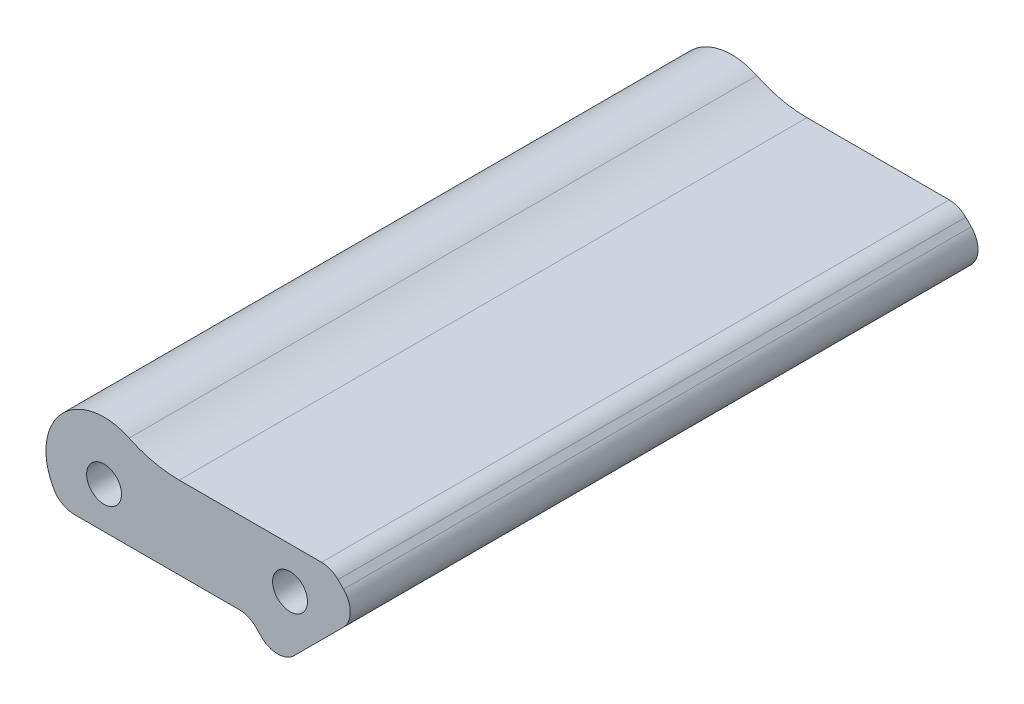
ISO-10303-21;
HEADER;
FILE_DESCRIPTION(('STEP AP214'),'2;1');
FILE_NAME('part.step','',(''),(''),'','','');
FILE_SCHEMA(('AUTOMOTIVE_DESIGN { 1 0 10303 214 1 1 1 1 }'));
ENDSEC;
DATA;
#1=APPLICATION_CONTEXT('core data for automotive mechanical design processes');
#2=APPLICATION_PROTOCOL_DEFINITION('international standard','automotive_design',2000,#1);
#3=PRODUCT_CONTEXT('',#1,'mechanical');
#4=PRODUCT('Part','Part','',(#3));
#5=PRODUCT_RELATED_PRODUCT_CATEGORY('part','',(#4));
#6=PRODUCT_DEFINITION_FORMATION('','',#4);
#7=PRODUCT_DEFINITION_CONTEXT('part definition',#1,'design');
#8=PRODUCT_DEFINITION('design','',#6,#7);
#9=PRODUCT_DEFINITION_SHAPE('','',#8);
#10=(LENGTH_UNIT() NAMED_UNIT(*) SI_UNIT(.MILLI.,.METRE.));
#11=(NAMED_UNIT(*) PLANE_ANGLE_UNIT() SI_UNIT($,.RADIAN.));
#12=(NAMED_UNIT(*) SI_UNIT($,.STERADIAN.) SOLID_ANGLE_UNIT());
#13=UNCERTAINTY_MEASURE_WITH_UNIT(LENGTH_MEASURE(1.E-05),#10,'distance_accuracy_value','');
#14=(GEOMETRIC_REPRESENTATION_CONTEXT(3) GLOBAL_UNCERTAINTY_ASSIGNED_CONTEXT((#13)) GLOBAL_UNIT_ASSIGNED_CONTEXT((#10,
#11,#12)) REPRESENTATION_CONTEXT('',''));
#15=CARTESIAN_POINT('',(0.,0.,0.));
#16=DIRECTION('',(0.,0.,1.));
#17=DIRECTION('',(1.,0.,0.));
#18=AXIS2_PLACEMENT_3D('',#15,#16,#17);
#19=CARTESIAN_POINT('',(10.7071067811866,1.53553390593272,54.));
#20=DIRECTION('',(0.,0.,1.));
#21=DIRECTION('',(1.,0.,0.));
#22=AXIS2_PLACEMENT_3D('',#19,#20,#21);
#23=PLANE('',#22);
#24=CARTESIAN_POINT('',(-8.,0.,54.));
#25=DIRECTION('',(0.,0.,1.));
#26=DIRECTION('',(1.,0.,0.));
#27=AXIS2_PLACEMENT_3D('',#24,#25,#26);
#28=CIRCLE('',#27,1.5);
#29=CARTESIAN_POINT('',(-6.5,0.,54.));
#30=VERTEX_POINT('',#29);
#31=EDGE_CURVE('E166',#30,#30,#28,.T.);
#32=ORIENTED_EDGE('',*,*,#31,.F.);
#33=EDGE_LOOP('',(#32));
#34=FACE_BOUND('',#33,.T.);
#35=CARTESIAN_POINT('',(10.7071067811866,1.53553390593272,54.));
#36=DIRECTION('',(0.,0.,1.));
#37=DIRECTION('',(1.,0.,0.));
#38=AXIS2_PLACEMENT_3D('',#35,#36,#37);
#39=CIRCLE('',#38,2.);
#40=CARTESIAN_POINT('',(12.1213203435597,2.9497474683058,54.));
#41=VERTEX_POINT('',#40);
#42=CARTESIAN_POINT('',(10.7071067811865,3.53553390593272,54.));
#43=VERTEX_POINT('',#42);
#44=EDGE_CURVE('E185',#41,#43,#39,.T.);
#45=ORIENTED_EDGE('',*,*,#44,.T.);
#46=DIRECTION('',(-1.,0.,0.));
#47=VECTOR('',#46,1.);
#48=CARTESIAN_POINT('',(10.7071067811865,3.53553390593272,54.));
#49=LINE('',#48,#47);
#50=CARTESIAN_POINT('',(-1.5355339059327,3.53553390593273,54.));
#51=VERTEX_POINT('',#50);
#52=EDGE_CURVE('E113',#43,#51,#49,.T.);
#53=ORIENTED_EDGE('',*,*,#52,.T.);
#54=CARTESIAN_POINT('',(-1.5355339059327,13.5355339059327,54.));
#55=DIRECTION('',(0.,0.,-1.));
#56=DIRECTION('',(-1.,0.,0.));
#57=AXIS2_PLACEMENT_3D('',#54,#55,#56);
#58=CIRCLE('',#57,9.99999999999999);
#59=CARTESIAN_POINT('',(-5.84517796864423,4.51184463531091,54.));
#60=VERTEX_POINT('',#59);
#61=EDGE_CURVE('E212',#51,#60,#58,.T.);
#62=ORIENTED_EDGE('',*,*,#61,.T.);
#63=CARTESIAN_POINT('',(-8.,0.,54.));
#64=DIRECTION('',(0.,0.,1.));
#65=DIRECTION('',(1.,0.,0.));
#66=AXIS2_PLACEMENT_3D('',#63,#64,#65);
#67=CIRCLE('',#66,5.);
#68=CARTESIAN_POINT('',(-12.2953901723343,-2.55922317655453,54.));
#69=VERTEX_POINT('',#68);
#70=EDGE_CURVE('E231',#60,#69,#67,.T.);
#71=ORIENTED_EDGE('',*,*,#70,.T.);
#72=CARTESIAN_POINT('',(-10.5772341034006,-1.53553390593272,54.));
#73=DIRECTION('',(0.,0.,1.));
#74=DIRECTION('',(-1.,0.,0.));
#75=AXIS2_PLACEMENT_3D('',#72,#73,#74);
#76=CIRCLE('',#75,2.);
#77=CARTESIAN_POINT('',(-10.5772341034006,-3.53553390593272,54.));
#78=VERTEX_POINT('',#77);
#79=EDGE_CURVE('E228',#69,#78,#76,.T.);
#80=ORIENTED_EDGE('',*,*,#79,.T.);
#81=DIRECTION('',(1.,0.,0.));
#82=VECTOR('',#81,1.);
#83=CARTESIAN_POINT('',(-10.5772341034006,-3.53553390593272,54.));
#84=LINE('',#83,#82);
#85=CARTESIAN_POINT('',(3.63603896932104,-3.53553390593272,54.));
#86=VERTEX_POINT('',#85);
#87=EDGE_CURVE('E230',#78,#86,#84,.T.);
#88=ORIENTED_EDGE('',*,*,#87,.T.);
#89=CARTESIAN_POINT('',(3.63603896932105,-5.53553390593272,54.));
#90=DIRECTION('',(0.,0.,-1.));
#91=DIRECTION('',(-1.,0.,0.));
#92=AXIS2_PLACEMENT_3D('',#89,#90,#91);
#93=CIRCLE('',#92,2.);
#94=CARTESIAN_POINT('',(5.05025253169415,-4.12132034355963,54.));
#95=VERTEX_POINT('',#94);
#96=EDGE_CURVE('E233',#86,#95,#93,.T.);
#97=ORIENTED_EDGE('',*,*,#96,.T.);
#98=DIRECTION('',(0.707106781186545,-0.70710678118655,0.));
#99=VECTOR('',#98,1.);
#100=CARTESIAN_POINT('',(5.05025253169415,-4.12132034355963,54.));
#101=LINE('',#100,#99);
#102=CARTESIAN_POINT('',(5.52512626584705,-4.59619407771254,54.));
#103=VERTEX_POINT('',#102);
#104=EDGE_CURVE('E239',#95,#103,#101,.T.);
#105=ORIENTED_EDGE('',*,*,#104,.T.);
#106=CARTESIAN_POINT('',(6.93933982822016,-3.18198051533946,54.));
#107=DIRECTION('',(0.,0.,1.));
#108=DIRECTION('',(1.,0.,0.));
#109=AXIS2_PLACEMENT_3D('',#106,#107,#108);
#110=CIRCLE('',#109,2.);
#111=CARTESIAN_POINT('',(8.35355339059326,-4.59619407771255,54.));
#112=VERTEX_POINT('',#111);
#113=EDGE_CURVE('E144',#103,#112,#110,.T.);
#114=ORIENTED_EDGE('',*,*,#113,.T.);
#115=DIRECTION('',(0.707106781186551,0.707106781186544,0.));
#116=VECTOR('',#115,1.);
#117=CARTESIAN_POINT('',(8.35355339059326,-4.59619407771255,54.));
#118=LINE('',#117,#116);
#119=CARTESIAN_POINT('',(12.5961940777125,-0.353553390593309,54.));
#120=VERTEX_POINT('',#119);
#121=EDGE_CURVE('E138',#112,#120,#118,.T.);
#122=ORIENTED_EDGE('',*,*,#121,.T.);
#123=CARTESIAN_POINT('',(11.1819805153395,1.0606601717798,54.));
#124=DIRECTION('',(0.,0.,1.));
#125=DIRECTION('',(1.,0.,0.));
#126=AXIS2_PLACEMENT_3D('',#123,#124,#125);
#127=CIRCLE('',#126,2.);
#128=CARTESIAN_POINT('',(12.5961940777126,2.4748737341529,54.));
#129=VERTEX_POINT('',#128);
#130=EDGE_CURVE('E142',#120,#129,#127,.T.);
#131=ORIENTED_EDGE('',*,*,#130,.T.);
#132=DIRECTION('',(-0.707106781186543,0.707106781186552,0.));
#133=VECTOR('',#132,1.);
#134=CARTESIAN_POINT('',(12.5961940777126,2.4748737341529,54.));
#135=LINE('',#134,#133);
#136=EDGE_CURVE('E58',#129,#41,#135,.T.);
#137=ORIENTED_EDGE('',*,*,#136,.T.);
#138=EDGE_LOOP('',(#45,#53,#62,#71,#80,#88,#97,#105,#114,#122,#131,#137));
#139=FACE_BOUND('',#138,.T.);
#140=CARTESIAN_POINT('',(8.,0.,54.));
#141=DIRECTION('',(0.,0.,1.));
#142=DIRECTION('',(1.,0.,0.));
#143=AXIS2_PLACEMENT_3D('',#140,#141,#142);
#144=CIRCLE('',#143,1.5);
#145=CARTESIAN_POINT('',(9.5,0.,54.));
#146=VERTEX_POINT('',#145);
#147=EDGE_CURVE('E281',#146,#146,#144,.T.);
#148=ORIENTED_EDGE('',*,*,#147,.F.);
#149=EDGE_LOOP('',(#148));
#150=FACE_BOUND('',#149,.T.);
#151=ADVANCED_FACE('F41',(#34,#139,#150),#23,.T.);
#152=CARTESIAN_POINT('',(10.7071067811866,1.53553390593272,0.));
#153=DIRECTION('',(0.,0.,1.));
#154=DIRECTION('',(1.,0.,0.));
#155=AXIS2_PLACEMENT_3D('',#152,#153,#154);
#156=PLANE('',#155);
#157=CARTESIAN_POINT('',(10.7071067811866,1.53553390593272,0.));
#158=DIRECTION('',(0.,0.,1.));
#159=DIRECTION('',(1.,0.,0.));
#160=AXIS2_PLACEMENT_3D('',#157,#158,#159);
#161=CIRCLE('',#160,2.);
#162=CARTESIAN_POINT('',(12.1213203435597,2.9497474683058,0.));
#163=VERTEX_POINT('',#162);
#164=CARTESIAN_POINT('',(10.7071067811865,3.53553390593272,0.));
#165=VERTEX_POINT('',#164);
#166=EDGE_CURVE('E162',#163,#165,#161,.T.);
#167=ORIENTED_EDGE('',*,*,#166,.F.);
#168=DIRECTION('',(-0.707106781186543,0.707106781186552,0.));
#169=VECTOR('',#168,1.);
#170=CARTESIAN_POINT('',(12.5961940777126,2.4748737341529,0.));
#171=LINE('',#170,#169);
#172=CARTESIAN_POINT('',(12.5961940777126,2.4748737341529,0.));
#173=VERTEX_POINT('',#172);
#174=EDGE_CURVE('E105',#173,#163,#171,.T.);
#175=ORIENTED_EDGE('',*,*,#174,.F.);
#176=CARTESIAN_POINT('',(11.1819805153395,1.0606601717798,0.));
#177=DIRECTION('',(0.,0.,1.));
#178=DIRECTION('',(1.,0.,0.));
#179=AXIS2_PLACEMENT_3D('',#176,#177,#178);
#180=CIRCLE('',#179,2.);
#181=CARTESIAN_POINT('',(12.5961940777125,-0.353553390593309,0.));
#182=VERTEX_POINT('',#181);
#183=EDGE_CURVE('E99',#182,#173,#180,.T.);
#184=ORIENTED_EDGE('',*,*,#183,.F.);
#185=DIRECTION('',(0.707106781186551,0.707106781186544,0.));
#186=VECTOR('',#185,1.);
#187=CARTESIAN_POINT('',(8.35355339059326,-4.59619407771255,0.));
#188=LINE('',#187,#186);
#189=CARTESIAN_POINT('',(8.35355339059326,-4.59619407771255,0.));
#190=VERTEX_POINT('',#189);
#191=EDGE_CURVE('E152',#190,#182,#188,.T.);
#192=ORIENTED_EDGE('',*,*,#191,.F.);
#193=CARTESIAN_POINT('',(6.93933982822016,-3.18198051533946,0.));
#194=DIRECTION('',(0.,0.,1.));
#195=DIRECTION('',(1.,0.,0.));
#196=AXIS2_PLACEMENT_3D('',#193,#194,#195);
#197=CIRCLE('',#196,2.);
#198=CARTESIAN_POINT('',(5.52512626584705,-4.59619407771254,0.));
#199=VERTEX_POINT('',#198);
#200=EDGE_CURVE('E180',#199,#190,#197,.T.);
#201=ORIENTED_EDGE('',*,*,#200,.F.);
#202=DIRECTION('',(0.707106781186545,-0.70710678118655,0.));
#203=VECTOR('',#202,1.);
#204=CARTESIAN_POINT('',(5.05025253169415,-4.12132034355963,0.));
#205=LINE('',#204,#203);
#206=CARTESIAN_POINT('',(5.05025253169415,-4.12132034355963,0.));
#207=VERTEX_POINT('',#206);
#208=EDGE_CURVE('E178',#207,#199,#205,.T.);
#209=ORIENTED_EDGE('',*,*,#208,.F.);
#210=CARTESIAN_POINT('',(3.63603896932105,-5.53553390593272,0.));
#211=DIRECTION('',(0.,0.,-1.));
#212=DIRECTION('',(-1.,0.,0.));
#213=AXIS2_PLACEMENT_3D('',#210,#211,#212);
#214=CIRCLE('',#213,2.);
#215=CARTESIAN_POINT('',(3.63603896932104,-3.53553390593272,0.));
#216=VERTEX_POINT('',#215);
#217=EDGE_CURVE('E176',#216,#207,#214,.T.);
#218=ORIENTED_EDGE('',*,*,#217,.F.);
#219=DIRECTION('',(1.,0.,0.));
#220=VECTOR('',#219,1.);
#221=CARTESIAN_POINT('',(-10.5772341034006,-3.53553390593272,0.));
#222=LINE('',#221,#220);
#223=CARTESIAN_POINT('',(-10.5772341034006,-3.53553390593272,0.));
#224=VERTEX_POINT('',#223);
#225=EDGE_CURVE('E174',#224,#216,#222,.T.);
#226=ORIENTED_EDGE('',*,*,#225,.F.);
#227=CARTESIAN_POINT('',(-10.5772341034006,-1.53553390593272,0.));
#228=DIRECTION('',(0.,0.,1.));
#229=DIRECTION('',(-1.,0.,0.));
#230=AXIS2_PLACEMENT_3D('',#227,#228,#229);
#231=CIRCLE('',#230,2.);
#232=CARTESIAN_POINT('',(-12.2953901723343,-2.55922317655453,0.));
#233=VERTEX_POINT('',#232);
#234=EDGE_CURVE('E172',#233,#224,#231,.T.);
#235=ORIENTED_EDGE('',*,*,#234,.F.);
#236=CARTESIAN_POINT('',(-8.,0.,0.));
#237=DIRECTION('',(0.,0.,1.));
#238=DIRECTION('',(1.,0.,0.));
#239=AXIS2_PLACEMENT_3D('',#236,#237,#238);
#240=CIRCLE('',#239,5.);
#241=CARTESIAN_POINT('',(-5.84517796864423,4.51184463531091,0.));
#242=VERTEX_POINT('',#241);
#243=EDGE_CURVE('E170',#242,#233,#240,.T.);
#244=ORIENTED_EDGE('',*,*,#243,.F.);
#245=CARTESIAN_POINT('',(-1.5355339059327,13.5355339059327,0.));
#246=DIRECTION('',(0.,0.,-1.));
#247=DIRECTION('',(-1.,0.,0.));
#248=AXIS2_PLACEMENT_3D('',#245,#246,#247);
#249=CIRCLE('',#248,9.99999999999999);
#250=CARTESIAN_POINT('',(-1.5355339059327,3.53553390593273,0.));
#251=VERTEX_POINT('',#250);
#252=EDGE_CURVE('E168',#251,#242,#249,.T.);
#253=ORIENTED_EDGE('',*,*,#252,.F.);
#254=DIRECTION('',(-1.,0.,0.));
#255=VECTOR('',#254,1.);
#256=CARTESIAN_POINT('',(10.7071067811865,3.53553390593272,0.));
#257=LINE('',#256,#255);
#258=EDGE_CURVE('E165',#165,#251,#257,.T.);
#259=ORIENTED_EDGE('',*,*,#258,.F.);
#260=EDGE_LOOP('',(#167,#175,#184,#192,#201,#209,#218,#226,#235,#244,#253,#259));
#261=FACE_BOUND('',#260,.T.);
#262=CARTESIAN_POINT('',(-8.,0.,0.));
#263=DIRECTION('',(0.,0.,1.));
#264=DIRECTION('',(1.,0.,0.));
#265=AXIS2_PLACEMENT_3D('',#262,#263,#264);
#266=CIRCLE('',#265,1.5);
#267=CARTESIAN_POINT('',(-6.5,0.,0.));
#268=VERTEX_POINT('',#267);
#269=EDGE_CURVE('E287',#268,#268,#266,.T.);
#270=ORIENTED_EDGE('',*,*,#269,.T.);
#271=EDGE_LOOP('',(#270));
#272=FACE_BOUND('',#271,.T.);
#273=CARTESIAN_POINT('',(8.,0.,0.));
#274=DIRECTION('',(0.,0.,1.));
#275=DIRECTION('',(1.,0.,0.));
#276=AXIS2_PLACEMENT_3D('',#273,#274,#275);
#277=CIRCLE('',#276,1.5);
#278=CARTESIAN_POINT('',(9.5,0.,0.));
#279=VERTEX_POINT('',#278);
#280=EDGE_CURVE('E284',#279,#279,#277,.T.);
#281=ORIENTED_EDGE('',*,*,#280,.T.);
#282=EDGE_LOOP('',(#281));
#283=FACE_BOUND('',#282,.T.);
#284=ADVANCED_FACE('F216',(#261,#272,#283),#156,.F.);
#285=CARTESIAN_POINT('',(10.7071067811866,1.53553390593272,54.));
#286=DIRECTION('',(0.,0.,-1.));
#287=DIRECTION('',(-1.,0.,0.));
#288=AXIS2_PLACEMENT_3D('',#285,#286,#287);
#289=CYLINDRICAL_SURFACE('',#288,2.);
#290=ORIENTED_EDGE('',*,*,#166,.T.);
#291=DIRECTION('',(0.,0.,-1.));
#292=VECTOR('',#291,1.);
#293=CARTESIAN_POINT('',(10.7071067811865,3.53553390593272,54.));
#294=LINE('',#293,#292);
#295=EDGE_CURVE('E11',#43,#165,#294,.T.);
#296=ORIENTED_EDGE('',*,*,#295,.F.);
#297=ORIENTED_EDGE('',*,*,#44,.F.);
#298=DIRECTION('',(0.,0.,-1.));
#299=VECTOR('',#298,1.);
#300=CARTESIAN_POINT('',(12.1213203435597,2.9497474683058,54.));
#301=LINE('',#300,#299);
#302=EDGE_CURVE('E158',#41,#163,#301,.T.);
#303=ORIENTED_EDGE('',*,*,#302,.T.);
#304=EDGE_LOOP('',(#290,#296,#297,#303));
#305=FACE_BOUND('',#304,.T.);
#306=ADVANCED_FACE('F43',(#305),#289,.T.);
#307=CARTESIAN_POINT('',(10.7071067811865,3.53553390593272,54.));
#308=DIRECTION('',(0.,-1.,0.));
#309=DIRECTION('',(1.,0.,0.));
#310=AXIS2_PLACEMENT_3D('',#307,#308,#309);
#311=PLANE('',#310);
#312=ORIENTED_EDGE('',*,*,#258,.T.);
#313=DIRECTION('',(0.,0.,-1.));
#314=VECTOR('',#313,1.);
#315=CARTESIAN_POINT('',(-1.5355339059327,3.53553390593273,54.));
#316=LINE('',#315,#314);
#317=EDGE_CURVE('E50',#51,#251,#316,.T.);
#318=ORIENTED_EDGE('',*,*,#317,.F.);
#319=ORIENTED_EDGE('',*,*,#52,.F.);
#320=ORIENTED_EDGE('',*,*,#295,.T.);
#321=EDGE_LOOP('',(#312,#318,#319,#320));
#322=FACE_BOUND('',#321,.T.);
#323=ADVANCED_FACE('F382',(#322),#311,.F.);
#324=CARTESIAN_POINT('',(-1.5355339059327,13.5355339059327,54.));
#325=DIRECTION('',(0.,0.,-1.));
#326=DIRECTION('',(-1.,0.,0.));
#327=AXIS2_PLACEMENT_3D('',#324,#325,#326);
#328=CYLINDRICAL_SURFACE('',#327,9.99999999999999);
#329=ORIENTED_EDGE('',*,*,#252,.T.);
#330=DIRECTION('',(0.,0.,-1.));
#331=VECTOR('',#330,1.);
#332=CARTESIAN_POINT('',(-5.84517796864423,4.51184463531091,54.));
#333=LINE('',#332,#331);
#334=EDGE_CURVE('E204',#60,#242,#333,.T.);
#335=ORIENTED_EDGE('',*,*,#334,.F.);
#336=ORIENTED_EDGE('',*,*,#61,.F.);
#337=ORIENTED_EDGE('',*,*,#317,.T.);
#338=EDGE_LOOP('',(#329,#335,#336,#337));
#339=FACE_BOUND('',#338,.T.);
#340=ADVANCED_FACE('F210',(#339),#328,.F.);
#341=CARTESIAN_POINT('',(-8.,0.,54.));
#342=DIRECTION('',(0.,0.,-1.));
#343=DIRECTION('',(-1.,0.,0.));
#344=AXIS2_PLACEMENT_3D('',#341,#342,#343);
#345=CYLINDRICAL_SURFACE('',#344,5.);
#346=ORIENTED_EDGE('',*,*,#243,.T.);
#347=DIRECTION('',(0.,0.,-1.));
#348=VECTOR('',#347,1.);
#349=CARTESIAN_POINT('',(-12.2953901723343,-2.55922317655453,54.));
#350=LINE('',#349,#348);
#351=EDGE_CURVE('E201',#69,#233,#350,.T.);
#352=ORIENTED_EDGE('',*,*,#351,.F.);
#353=ORIENTED_EDGE('',*,*,#70,.F.);
#354=ORIENTED_EDGE('',*,*,#334,.T.);
#355=EDGE_LOOP('',(#346,#352,#353,#354));
#356=FACE_BOUND('',#355,.T.);
#357=ADVANCED_FACE('F222',(#356),#345,.T.);
#358=CARTESIAN_POINT('',(-10.5772341034006,-1.53553390593272,54.));
#359=DIRECTION('',(0.,0.,-1.));
#360=DIRECTION('',(-1.,0.,0.));
#361=AXIS2_PLACEMENT_3D('',#358,#359,#360);
#362=CYLINDRICAL_SURFACE('',#361,2.);
#363=ORIENTED_EDGE('',*,*,#234,.T.);
#364=DIRECTION('',(0.,0.,-1.));
#365=VECTOR('',#364,1.);
#366=CARTESIAN_POINT('',(-10.5772341034006,-3.53553390593272,54.));
#367=LINE('',#366,#365);
#368=EDGE_CURVE('E198',#78,#224,#367,.T.);
#369=ORIENTED_EDGE('',*,*,#368,.F.);
#370=ORIENTED_EDGE('',*,*,#79,.F.);
#371=ORIENTED_EDGE('',*,*,#351,.T.);
#372=EDGE_LOOP('',(#363,#369,#370,#371));
#373=FACE_BOUND('',#372,.T.);
#374=ADVANCED_FACE('F226',(#373),#362,.T.);
#375=CARTESIAN_POINT('',(-10.5772341034006,-3.53553390593272,54.));
#376=DIRECTION('',(0.,1.,0.));
#377=DIRECTION('',(0.,0.,1.));
#378=AXIS2_PLACEMENT_3D('',#375,#376,#377);
#379=PLANE('',#378);
#380=ORIENTED_EDGE('',*,*,#225,.T.);
#381=DIRECTION('',(0.,0.,-1.));
#382=VECTOR('',#381,1.);
#383=CARTESIAN_POINT('',(3.63603896932104,-3.53553390593272,54.));
#384=LINE('',#383,#382);
#385=EDGE_CURVE('E195',#86,#216,#384,.T.);
#386=ORIENTED_EDGE('',*,*,#385,.F.);
#387=ORIENTED_EDGE('',*,*,#87,.F.);
#388=ORIENTED_EDGE('',*,*,#368,.T.);
#389=EDGE_LOOP('',(#380,#386,#387,#388));
#390=FACE_BOUND('',#389,.T.);
#391=ADVANCED_FACE('F347',(#390),#379,.F.);
#392=CARTESIAN_POINT('',(3.63603896932105,-5.53553390593272,54.));
#393=DIRECTION('',(0.,0.,-1.));
#394=DIRECTION('',(-1.,0.,0.));
#395=AXIS2_PLACEMENT_3D('',#392,#393,#394);
#396=CYLINDRICAL_SURFACE('',#395,2.);
#397=ORIENTED_EDGE('',*,*,#217,.T.);
#398=DIRECTION('',(0.,0.,-1.));
#399=VECTOR('',#398,1.);
#400=CARTESIAN_POINT('',(5.05025253169415,-4.12132034355963,54.));
#401=LINE('',#400,#399);
#402=EDGE_CURVE('E192',#95,#207,#401,.T.);
#403=ORIENTED_EDGE('',*,*,#402,.F.);
#404=ORIENTED_EDGE('',*,*,#96,.F.);
#405=ORIENTED_EDGE('',*,*,#385,.T.);
#406=EDGE_LOOP('',(#397,#403,#404,#405));
#407=FACE_BOUND('',#406,.T.);
#408=ADVANCED_FACE('F338',(#407),#396,.F.);
#409=CARTESIAN_POINT('',(5.05025253169415,-4.12132034355963,54.));
#410=DIRECTION('',(0.70710678118655,0.707106781186545,0.));
#411=DIRECTION('',(-0.707106781186545,0.70710678118655,0.));
#412=AXIS2_PLACEMENT_3D('',#409,#410,#411);
#413=PLANE('',#412);
#414=ORIENTED_EDGE('',*,*,#208,.T.);
#415=DIRECTION('',(0.,0.,-1.));
#416=VECTOR('',#415,1.);
#417=CARTESIAN_POINT('',(5.52512626584705,-4.59619407771254,54.));
#418=LINE('',#417,#416);
#419=EDGE_CURVE('E189',#103,#199,#418,.T.);
#420=ORIENTED_EDGE('',*,*,#419,.F.);
#421=ORIENTED_EDGE('',*,*,#104,.F.);
#422=ORIENTED_EDGE('',*,*,#402,.T.);
#423=EDGE_LOOP('',(#414,#420,#421,#422));
#424=FACE_BOUND('',#423,.T.);
#425=ADVANCED_FACE('F245',(#424),#413,.F.);
#426=CARTESIAN_POINT('',(6.93933982822016,-3.18198051533946,54.));
#427=DIRECTION('',(0.,0.,-1.));
#428=DIRECTION('',(-1.,0.,0.));
#429=AXIS2_PLACEMENT_3D('',#426,#427,#428);
#430=CYLINDRICAL_SURFACE('',#429,2.);
#431=ORIENTED_EDGE('',*,*,#200,.T.);
#432=DIRECTION('',(0.,0.,-1.));
#433=VECTOR('',#432,1.);
#434=CARTESIAN_POINT('',(8.35355339059326,-4.59619407771255,54.));
#435=LINE('',#434,#433);
#436=EDGE_CURVE('E153',#112,#190,#435,.T.);
#437=ORIENTED_EDGE('',*,*,#436,.F.);
#438=ORIENTED_EDGE('',*,*,#113,.F.);
#439=ORIENTED_EDGE('',*,*,#419,.T.);
#440=EDGE_LOOP('',(#431,#437,#438,#439));
#441=FACE_BOUND('',#440,.T.);
#442=ADVANCED_FACE('F249',(#441),#430,.T.);
#443=CARTESIAN_POINT('',(8.35355339059326,-4.59619407771255,54.));
#444=DIRECTION('',(-0.707106781186544,0.707106781186551,0.));
#445=DIRECTION('',(-0.707106781186551,-0.707106781186544,0.));
#446=AXIS2_PLACEMENT_3D('',#443,#444,#445);
#447=PLANE('',#446);
#448=ORIENTED_EDGE('',*,*,#191,.T.);
#449=DIRECTION('',(0.,0.,-1.));
#450=VECTOR('',#449,1.);
#451=CARTESIAN_POINT('',(12.5961940777125,-0.353553390593309,54.));
#452=LINE('',#451,#450);
#453=EDGE_CURVE('E149',#120,#182,#452,.T.);
#454=ORIENTED_EDGE('',*,*,#453,.F.);
#455=ORIENTED_EDGE('',*,*,#121,.F.);
#456=ORIENTED_EDGE('',*,*,#436,.T.);
#457=EDGE_LOOP('',(#448,#454,#455,#456));
#458=FACE_BOUND('',#457,.T.);
#459=ADVANCED_FACE('F150',(#458),#447,.F.);
#460=CARTESIAN_POINT('',(11.1819805153395,1.0606601717798,54.));
#461=DIRECTION('',(0.,0.,-1.));
#462=DIRECTION('',(-1.,0.,0.));
#463=AXIS2_PLACEMENT_3D('',#460,#461,#462);
#464=CYLINDRICAL_SURFACE('',#463,2.);
#465=ORIENTED_EDGE('',*,*,#183,.T.);
#466=DIRECTION('',(0.,0.,-1.));
#467=VECTOR('',#466,1.);
#468=CARTESIAN_POINT('',(12.5961940777126,2.4748737341529,54.));
#469=LINE('',#468,#467);
#470=EDGE_CURVE('E154',#129,#173,#469,.T.);
#471=ORIENTED_EDGE('',*,*,#470,.F.);
#472=ORIENTED_EDGE('',*,*,#130,.F.);
#473=ORIENTED_EDGE('',*,*,#453,.T.);
#474=EDGE_LOOP('',(#465,#471,#472,#473));
#475=FACE_BOUND('',#474,.T.);
#476=ADVANCED_FACE('F156',(#475),#464,.T.);
#477=CARTESIAN_POINT('',(12.5961940777126,2.4748737341529,54.));
#478=DIRECTION('',(-0.707106781186552,-0.707106781186543,0.));
#479=DIRECTION('',(0.707106781186543,-0.707106781186552,0.));
#480=AXIS2_PLACEMENT_3D('',#477,#478,#479);
#481=PLANE('',#480);
#482=ORIENTED_EDGE('',*,*,#174,.T.);
#483=ORIENTED_EDGE('',*,*,#302,.F.);
#484=ORIENTED_EDGE('',*,*,#136,.F.);
#485=ORIENTED_EDGE('',*,*,#470,.T.);
#486=EDGE_LOOP('',(#482,#483,#484,#485));
#487=FACE_BOUND('',#486,.T.);
#488=ADVANCED_FACE('F253',(#487),#481,.F.);
#489=CARTESIAN_POINT('',(-8.,0.,54.));
#490=DIRECTION('',(0.,0.,-1.));
#491=DIRECTION('',(-1.,0.,0.));
#492=AXIS2_PLACEMENT_3D('',#489,#490,#491);
#493=CYLINDRICAL_SURFACE('',#492,1.5);
#494=ORIENTED_EDGE('',*,*,#31,.T.);
#495=EDGE_LOOP('',(#494));
#496=FACE_BOUND('',#495,.T.);
#497=ORIENTED_EDGE('',*,*,#269,.F.);
#498=EDGE_LOOP('',(#497));
#499=FACE_BOUND('',#498,.T.);
#500=ADVANCED_FACE('F255',(#496,#499),#493,.F.);
#501=CARTESIAN_POINT('',(8.,0.,54.));
#502=DIRECTION('',(0.,0.,-1.));
#503=DIRECTION('',(-1.,0.,0.));
#504=AXIS2_PLACEMENT_3D('',#501,#502,#503);
#505=CYLINDRICAL_SURFACE('',#504,1.5);
#506=ORIENTED_EDGE('',*,*,#147,.T.);
#507=EDGE_LOOP('',(#506));
#508=FACE_BOUND('',#507,.T.);
#509=ORIENTED_EDGE('',*,*,#280,.F.);
#510=EDGE_LOOP('',(#509));
#511=FACE_BOUND('',#510,.T.);
#512=ADVANCED_FACE('F261',(#508,#511),#505,.F.);
#513=CLOSED_SHELL('',(#151,#284,#306,#323,#340,#357,#374,#391,#408,#425,#442,#459,#476,#488,
#500,#512));
#514=MANIFOLD_SOLID_BREP('B2',#513);
#515=ADVANCED_BREP_SHAPE_REPRESENTATION('',(#18,#514),#14);
#516=SHAPE_DEFINITION_REPRESENTATION(#9,#515);
ENDSEC;
END-ISO-10303-21;
